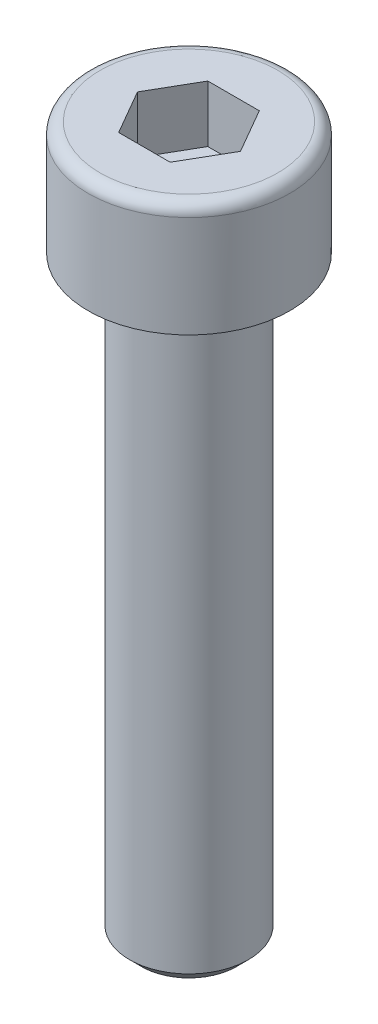
ISO-10303-21;
HEADER;
FILE_DESCRIPTION(('STEP AP214'),'2;1');
FILE_NAME('part.step','',(''),(''),'','','');
FILE_SCHEMA(('AUTOMOTIVE_DESIGN { 1 0 10303 214 1 1 1 1 }'));
ENDSEC;
DATA;
#1=APPLICATION_CONTEXT('core data for automotive mechanical design processes');
#2=APPLICATION_PROTOCOL_DEFINITION('international standard','automotive_design',2000,#1);
#3=PRODUCT_CONTEXT('',#1,'mechanical');
#4=PRODUCT('Part','Part','',(#3));
#5=PRODUCT_RELATED_PRODUCT_CATEGORY('part','',(#4));
#6=PRODUCT_DEFINITION_FORMATION('','',#4);
#7=PRODUCT_DEFINITION_CONTEXT('part definition',#1,'design');
#8=PRODUCT_DEFINITION('design','',#6,#7);
#9=PRODUCT_DEFINITION_SHAPE('','',#8);
#10=(LENGTH_UNIT() NAMED_UNIT(*) SI_UNIT(.MILLI.,.METRE.));
#11=(NAMED_UNIT(*) PLANE_ANGLE_UNIT() SI_UNIT($,.RADIAN.));
#12=(NAMED_UNIT(*) SI_UNIT($,.STERADIAN.) SOLID_ANGLE_UNIT());
#13=UNCERTAINTY_MEASURE_WITH_UNIT(LENGTH_MEASURE(1.E-05),#10,'distance_accuracy_value','');
#14=(GEOMETRIC_REPRESENTATION_CONTEXT(3) GLOBAL_UNCERTAINTY_ASSIGNED_CONTEXT((#13)) GLOBAL_UNIT_ASSIGNED_CONTEXT((#10,
#11,#12)) REPRESENTATION_CONTEXT('',''));
#15=CARTESIAN_POINT('',(0.,0.,0.));
#16=DIRECTION('',(0.,0.,1.));
#17=DIRECTION('',(1.,0.,0.));
#18=AXIS2_PLACEMENT_3D('',#15,#16,#17);
#19=CARTESIAN_POINT('',(2.,-20.,0.));
#20=DIRECTION('',(0.,-1.,0.));
#21=DIRECTION('',(0.,0.,-1.));
#22=AXIS2_PLACEMENT_3D('',#19,#20,#21);
#23=PLANE('',#22);
#24=CARTESIAN_POINT('',(0.,-20.,0.));
#25=DIRECTION('',(0.,-1.,0.));
#26=DIRECTION('',(0.,0.,-1.));
#27=AXIS2_PLACEMENT_3D('',#24,#25,#26);
#28=CIRCLE('',#27,1.6);
#29=CARTESIAN_POINT('',(0.,-20.,-1.6));
#30=VERTEX_POINT('',#29);
#31=EDGE_CURVE('E145',#30,#30,#28,.T.);
#32=ORIENTED_EDGE('',*,*,#31,.T.);
#33=EDGE_LOOP('',(#32));
#34=FACE_BOUND('',#33,.T.);
#35=ADVANCED_FACE('F32',(#34),#23,.T.);
#36=CARTESIAN_POINT('',(0.,3.82,0.));
#37=DIRECTION('',(0.,1.,0.));
#38=DIRECTION('',(0.,0.,1.));
#39=AXIS2_PLACEMENT_3D('',#36,#37,#38);
#40=PLANE('',#39);
#41=DIRECTION('',(1.,0.,0.));
#42=VECTOR('',#41,1.);
#43=CARTESIAN_POINT('',(-0.866025403784438,3.82,1.5));
#44=LINE('',#43,#42);
#45=CARTESIAN_POINT('',(-0.866025403784438,3.82,1.5));
#46=VERTEX_POINT('',#45);
#47=CARTESIAN_POINT('',(0.866025403784439,3.82,1.5));
#48=VERTEX_POINT('',#47);
#49=EDGE_CURVE('E47',#46,#48,#44,.T.);
#50=ORIENTED_EDGE('',*,*,#49,.F.);
#51=DIRECTION('',(0.5,0.,0.866025403784438));
#52=VECTOR('',#51,1.);
#53=CARTESIAN_POINT('',(-1.73205080756888,3.82,0.));
#54=LINE('',#53,#52);
#55=CARTESIAN_POINT('',(-1.73205080756888,3.82,0.));
#56=VERTEX_POINT('',#55);
#57=EDGE_CURVE('E130',#56,#46,#54,.T.);
#58=ORIENTED_EDGE('',*,*,#57,.F.);
#59=DIRECTION('',(-0.5,0.,0.866025403784439));
#60=VECTOR('',#59,1.);
#61=CARTESIAN_POINT('',(-0.866025403784439,3.82,-1.5));
#62=LINE('',#61,#60);
#63=CARTESIAN_POINT('',(-0.866025403784439,3.82,-1.5));
#64=VERTEX_POINT('',#63);
#65=EDGE_CURVE('E128',#64,#56,#62,.T.);
#66=ORIENTED_EDGE('',*,*,#65,.F.);
#67=DIRECTION('',(-1.,0.,0.));
#68=VECTOR('',#67,1.);
#69=CARTESIAN_POINT('',(0.866025403784438,3.82,-1.5));
#70=LINE('',#69,#68);
#71=CARTESIAN_POINT('',(0.866025403784438,3.82,-1.5));
#72=VERTEX_POINT('',#71);
#73=EDGE_CURVE('E95',#72,#64,#70,.T.);
#74=ORIENTED_EDGE('',*,*,#73,.F.);
#75=DIRECTION('',(-0.5,0.,-0.866025403784438));
#76=VECTOR('',#75,1.);
#77=CARTESIAN_POINT('',(1.73205080756888,3.82,0.));
#78=LINE('',#77,#76);
#79=CARTESIAN_POINT('',(1.73205080756888,3.82,0.));
#80=VERTEX_POINT('',#79);
#81=EDGE_CURVE('E124',#80,#72,#78,.T.);
#82=ORIENTED_EDGE('',*,*,#81,.F.);
#83=DIRECTION('',(0.5,0.,-0.866025403784438));
#84=VECTOR('',#83,1.);
#85=CARTESIAN_POINT('',(0.866025403784438,3.82,1.5));
#86=LINE('',#85,#84);
#87=EDGE_CURVE('E121',#48,#80,#86,.T.);
#88=ORIENTED_EDGE('',*,*,#87,.F.);
#89=EDGE_LOOP('',(#50,#58,#66,#74,#82,#88));
#90=FACE_BOUND('',#89,.T.);
#91=CARTESIAN_POINT('',(0.,3.82,0.));
#92=DIRECTION('',(0.,1.,0.));
#93=DIRECTION('',(0.,0.,1.));
#94=AXIS2_PLACEMENT_3D('',#91,#92,#93);
#95=CIRCLE('',#94,2.99);
#96=CARTESIAN_POINT('',(0.,3.82,2.99));
#97=VERTEX_POINT('',#96);
#98=EDGE_CURVE('E11',#97,#97,#95,.T.);
#99=ORIENTED_EDGE('',*,*,#98,.T.);
#100=EDGE_LOOP('',(#99));
#101=FACE_BOUND('',#100,.T.);
#102=ADVANCED_FACE('F170',(#90,#101),#40,.T.);
#103=CARTESIAN_POINT('',(0.,3.82,0.));
#104=DIRECTION('',(0.,-1.,0.));
#105=DIRECTION('',(0.,0.,-1.));
#106=AXIS2_PLACEMENT_3D('',#103,#104,#105);
#107=CYLINDRICAL_SURFACE('',#106,3.39);
#108=CARTESIAN_POINT('',(0.,3.42,0.));
#109=DIRECTION('',(0.,1.,0.));
#110=DIRECTION('',(0.,0.,1.));
#111=AXIS2_PLACEMENT_3D('',#108,#109,#110);
#112=CIRCLE('',#111,3.39);
#113=CARTESIAN_POINT('',(0.,3.42,3.39));
#114=VERTEX_POINT('',#113);
#115=EDGE_CURVE('E40',#114,#114,#112,.F.);
#116=ORIENTED_EDGE('',*,*,#115,.T.);
#117=EDGE_LOOP('',(#116));
#118=FACE_BOUND('',#117,.T.);
#119=CARTESIAN_POINT('',(0.,0.,0.));
#120=DIRECTION('',(0.,-1.,0.));
#121=DIRECTION('',(0.,0.,-1.));
#122=AXIS2_PLACEMENT_3D('',#119,#120,#121);
#123=CIRCLE('',#122,3.39);
#124=CARTESIAN_POINT('',(0.,0.,-3.39));
#125=VERTEX_POINT('',#124);
#126=EDGE_CURVE('E142',#125,#125,#123,.T.);
#127=ORIENTED_EDGE('',*,*,#126,.F.);
#128=EDGE_LOOP('',(#127));
#129=FACE_BOUND('',#128,.T.);
#130=ADVANCED_FACE('F153',(#118,#129),#107,.T.);
#131=CARTESIAN_POINT('',(3.39,0.,0.));
#132=DIRECTION('',(0.,-1.,0.));
#133=DIRECTION('',(0.,0.,-1.));
#134=AXIS2_PLACEMENT_3D('',#131,#132,#133);
#135=PLANE('',#134);
#136=ORIENTED_EDGE('',*,*,#126,.T.);
#137=EDGE_LOOP('',(#136));
#138=FACE_BOUND('',#137,.T.);
#139=CARTESIAN_POINT('',(0.,0.,0.));
#140=DIRECTION('',(0.,-1.,0.));
#141=DIRECTION('',(0.,0.,-1.));
#142=AXIS2_PLACEMENT_3D('',#139,#140,#141);
#143=CIRCLE('',#142,2.);
#144=CARTESIAN_POINT('',(0.,0.,-2.));
#145=VERTEX_POINT('',#144);
#146=EDGE_CURVE('E134',#145,#145,#143,.T.);
#147=ORIENTED_EDGE('',*,*,#146,.F.);
#148=EDGE_LOOP('',(#147));
#149=FACE_BOUND('',#148,.T.);
#150=ADVANCED_FACE('F181',(#138,#149),#135,.T.);
#151=CARTESIAN_POINT('',(0.,3.82,0.));
#152=DIRECTION('',(0.,-1.,0.));
#153=DIRECTION('',(0.,0.,-1.));
#154=AXIS2_PLACEMENT_3D('',#151,#152,#153);
#155=CYLINDRICAL_SURFACE('',#154,2.);
#156=CARTESIAN_POINT('',(0.,-19.6,0.));
#157=DIRECTION('',(0.,-1.,0.));
#158=DIRECTION('',(0.,0.,-1.));
#159=AXIS2_PLACEMENT_3D('',#156,#157,#158);
#160=CIRCLE('',#159,2.);
#161=CARTESIAN_POINT('',(0.,-19.6,-2.));
#162=VERTEX_POINT('',#161);
#163=EDGE_CURVE('E148',#162,#162,#160,.F.);
#164=ORIENTED_EDGE('',*,*,#163,.T.);
#165=EDGE_LOOP('',(#164));
#166=FACE_BOUND('',#165,.T.);
#167=ORIENTED_EDGE('',*,*,#146,.T.);
#168=EDGE_LOOP('',(#167));
#169=FACE_BOUND('',#168,.T.);
#170=ADVANCED_FACE('F166',(#166,#169),#155,.T.);
#171=CARTESIAN_POINT('',(0.,-20.,0.));
#172=DIRECTION('',(0.,1.,0.));
#173=DIRECTION('',(0.,0.,1.));
#174=AXIS2_PLACEMENT_3D('',#171,#172,#173);
#175=CONICAL_SURFACE('',#174,1.6,0.785398163397444);
#176=ORIENTED_EDGE('',*,*,#163,.F.);
#177=EDGE_LOOP('',(#176));
#178=FACE_BOUND('',#177,.T.);
#179=ORIENTED_EDGE('',*,*,#31,.F.);
#180=EDGE_LOOP('',(#179));
#181=FACE_BOUND('',#180,.T.);
#182=ADVANCED_FACE('F158',(#178,#181),#175,.T.);
#183=CARTESIAN_POINT('',(0.,3.42,0.));
#184=DIRECTION('',(0.,1.,0.));
#185=DIRECTION('',(0.,0.,1.));
#186=AXIS2_PLACEMENT_3D('',#183,#184,#185);
#187=TOROIDAL_SURFACE('',#186,2.99,0.4);
#188=ORIENTED_EDGE('',*,*,#98,.F.);
#189=EDGE_LOOP('',(#188));
#190=FACE_BOUND('',#189,.T.);
#191=ORIENTED_EDGE('',*,*,#115,.F.);
#192=EDGE_LOOP('',(#191));
#193=FACE_BOUND('',#192,.T.);
#194=ADVANCED_FACE('F34',(#190,#193),#187,.T.);
#195=CARTESIAN_POINT('',(-0.866025403784438,1.91,1.5));
#196=DIRECTION('',(0.,0.,1.));
#197=DIRECTION('',(1.,0.,0.));
#198=AXIS2_PLACEMENT_3D('',#195,#196,#197);
#199=PLANE('',#198);
#200=ORIENTED_EDGE('',*,*,#49,.T.);
#201=DIRECTION('',(0.,1.,0.));
#202=VECTOR('',#201,1.);
#203=CARTESIAN_POINT('',(0.866025403784438,1.91,1.5));
#204=LINE('',#203,#202);
#205=CARTESIAN_POINT('',(0.866025403784438,1.91,1.5));
#206=VERTEX_POINT('',#205);
#207=EDGE_CURVE('E77',#206,#48,#204,.T.);
#208=ORIENTED_EDGE('',*,*,#207,.F.);
#209=DIRECTION('',(1.,0.,0.));
#210=VECTOR('',#209,1.);
#211=CARTESIAN_POINT('',(-0.866025403784438,1.91,1.5));
#212=LINE('',#211,#210);
#213=CARTESIAN_POINT('',(-0.866025403784438,1.91,1.5));
#214=VERTEX_POINT('',#213);
#215=EDGE_CURVE('E132',#214,#206,#212,.T.);
#216=ORIENTED_EDGE('',*,*,#215,.F.);
#217=DIRECTION('',(0.,1.,0.));
#218=VECTOR('',#217,1.);
#219=CARTESIAN_POINT('',(-0.866025403784438,1.91,1.5));
#220=LINE('',#219,#218);
#221=EDGE_CURVE('E55',#214,#46,#220,.T.);
#222=ORIENTED_EDGE('',*,*,#221,.T.);
#223=EDGE_LOOP('',(#200,#208,#216,#222));
#224=FACE_BOUND('',#223,.T.);
#225=ADVANCED_FACE('F157',(#224),#199,.F.);
#226=CARTESIAN_POINT('',(-1.73205080756888,1.91,0.));
#227=DIRECTION('',(-0.866025403784438,0.,0.5));
#228=DIRECTION('',(0.5,0.,0.866025403784439));
#229=AXIS2_PLACEMENT_3D('',#226,#227,#228);
#230=PLANE('',#229);
#231=ORIENTED_EDGE('',*,*,#57,.T.);
#232=ORIENTED_EDGE('',*,*,#221,.F.);
#233=DIRECTION('',(0.5,0.,0.866025403784438));
#234=VECTOR('',#233,1.);
#235=CARTESIAN_POINT('',(-1.73205080756888,1.91,0.));
#236=LINE('',#235,#234);
#237=CARTESIAN_POINT('',(-1.73205080756888,1.91,0.));
#238=VERTEX_POINT('',#237);
#239=EDGE_CURVE('E107',#238,#214,#236,.T.);
#240=ORIENTED_EDGE('',*,*,#239,.F.);
#241=DIRECTION('',(0.,1.,0.));
#242=VECTOR('',#241,1.);
#243=CARTESIAN_POINT('',(-1.73205080756888,1.91,0.));
#244=LINE('',#243,#242);
#245=EDGE_CURVE('E99',#238,#56,#244,.T.);
#246=ORIENTED_EDGE('',*,*,#245,.T.);
#247=EDGE_LOOP('',(#231,#232,#240,#246));
#248=FACE_BOUND('',#247,.T.);
#249=ADVANCED_FACE('F164',(#248),#230,.F.);
#250=CARTESIAN_POINT('',(-0.866025403784439,1.91,-1.5));
#251=DIRECTION('',(-0.866025403784439,0.,-0.5));
#252=DIRECTION('',(-0.5,0.,0.866025403784439));
#253=AXIS2_PLACEMENT_3D('',#250,#251,#252);
#254=PLANE('',#253);
#255=ORIENTED_EDGE('',*,*,#65,.T.);
#256=ORIENTED_EDGE('',*,*,#245,.F.);
#257=DIRECTION('',(-0.5,0.,0.866025403784439));
#258=VECTOR('',#257,1.);
#259=CARTESIAN_POINT('',(-0.866025403784439,1.91,-1.5));
#260=LINE('',#259,#258);
#261=CARTESIAN_POINT('',(-0.866025403784439,1.91,-1.5));
#262=VERTEX_POINT('',#261);
#263=EDGE_CURVE('E103',#262,#238,#260,.T.);
#264=ORIENTED_EDGE('',*,*,#263,.F.);
#265=DIRECTION('',(0.,1.,0.));
#266=VECTOR('',#265,1.);
#267=CARTESIAN_POINT('',(-0.866025403784439,1.91,-1.5));
#268=LINE('',#267,#266);
#269=EDGE_CURVE('E88',#262,#64,#268,.T.);
#270=ORIENTED_EDGE('',*,*,#269,.T.);
#271=EDGE_LOOP('',(#255,#256,#264,#270));
#272=FACE_BOUND('',#271,.T.);
#273=ADVANCED_FACE('F104',(#272),#254,.F.);
#274=CARTESIAN_POINT('',(0.866025403784438,1.91,-1.5));
#275=DIRECTION('',(0.,0.,-1.));
#276=DIRECTION('',(-1.,0.,0.));
#277=AXIS2_PLACEMENT_3D('',#274,#275,#276);
#278=PLANE('',#277);
#279=ORIENTED_EDGE('',*,*,#73,.T.);
#280=ORIENTED_EDGE('',*,*,#269,.F.);
#281=DIRECTION('',(-1.,0.,0.));
#282=VECTOR('',#281,1.);
#283=CARTESIAN_POINT('',(0.866025403784438,1.91,-1.5));
#284=LINE('',#283,#282);
#285=CARTESIAN_POINT('',(0.866025403784438,1.91,-1.5));
#286=VERTEX_POINT('',#285);
#287=EDGE_CURVE('E92',#286,#262,#284,.T.);
#288=ORIENTED_EDGE('',*,*,#287,.F.);
#289=DIRECTION('',(0.,1.,0.));
#290=VECTOR('',#289,1.);
#291=CARTESIAN_POINT('',(0.866025403784438,1.91,-1.5));
#292=LINE('',#291,#290);
#293=EDGE_CURVE('E100',#286,#72,#292,.T.);
#294=ORIENTED_EDGE('',*,*,#293,.T.);
#295=EDGE_LOOP('',(#279,#280,#288,#294));
#296=FACE_BOUND('',#295,.T.);
#297=ADVANCED_FACE('F90',(#296),#278,.F.);
#298=CARTESIAN_POINT('',(1.73205080756888,1.91,0.));
#299=DIRECTION('',(0.866025403784438,0.,-0.5));
#300=DIRECTION('',(-0.5,0.,-0.866025403784438));
#301=AXIS2_PLACEMENT_3D('',#298,#299,#300);
#302=PLANE('',#301);
#303=ORIENTED_EDGE('',*,*,#81,.T.);
#304=ORIENTED_EDGE('',*,*,#293,.F.);
#305=DIRECTION('',(-0.5,0.,-0.866025403784438));
#306=VECTOR('',#305,1.);
#307=CARTESIAN_POINT('',(1.73205080756888,1.91,0.));
#308=LINE('',#307,#306);
#309=CARTESIAN_POINT('',(1.73205080756888,1.91,0.));
#310=VERTEX_POINT('',#309);
#311=EDGE_CURVE('E113',#310,#286,#308,.T.);
#312=ORIENTED_EDGE('',*,*,#311,.F.);
#313=DIRECTION('',(0.,1.,0.));
#314=VECTOR('',#313,1.);
#315=CARTESIAN_POINT('',(1.73205080756888,1.91,0.));
#316=LINE('',#315,#314);
#317=EDGE_CURVE('E137',#310,#80,#316,.T.);
#318=ORIENTED_EDGE('',*,*,#317,.T.);
#319=EDGE_LOOP('',(#303,#304,#312,#318));
#320=FACE_BOUND('',#319,.T.);
#321=ADVANCED_FACE('F191',(#320),#302,.F.);
#322=CARTESIAN_POINT('',(0.866025403784438,1.91,1.5));
#323=DIRECTION('',(0.866025403784439,0.,0.5));
#324=DIRECTION('',(0.5,0.,-0.866025403784439));
#325=AXIS2_PLACEMENT_3D('',#322,#323,#324);
#326=PLANE('',#325);
#327=ORIENTED_EDGE('',*,*,#87,.T.);
#328=ORIENTED_EDGE('',*,*,#317,.F.);
#329=DIRECTION('',(0.5,0.,-0.866025403784438));
#330=VECTOR('',#329,1.);
#331=CARTESIAN_POINT('',(0.866025403784438,1.91,1.5));
#332=LINE('',#331,#330);
#333=EDGE_CURVE('E115',#206,#310,#332,.T.);
#334=ORIENTED_EDGE('',*,*,#333,.F.);
#335=ORIENTED_EDGE('',*,*,#207,.T.);
#336=EDGE_LOOP('',(#327,#328,#334,#335));
#337=FACE_BOUND('',#336,.T.);
#338=ADVANCED_FACE('F188',(#337),#326,.F.);
#339=CARTESIAN_POINT('',(0.,1.91,0.));
#340=DIRECTION('',(0.,1.,0.));
#341=DIRECTION('',(0.,0.,1.));
#342=AXIS2_PLACEMENT_3D('',#339,#340,#341);
#343=PLANE('',#342);
#344=ORIENTED_EDGE('',*,*,#215,.T.);
#345=ORIENTED_EDGE('',*,*,#333,.T.);
#346=ORIENTED_EDGE('',*,*,#311,.T.);
#347=ORIENTED_EDGE('',*,*,#287,.T.);
#348=ORIENTED_EDGE('',*,*,#263,.T.);
#349=ORIENTED_EDGE('',*,*,#239,.T.);
#350=EDGE_LOOP('',(#344,#345,#346,#347,#348,#349));
#351=FACE_BOUND('',#350,.T.);
#352=ADVANCED_FACE('F110',(#351),#343,.T.);
#353=CLOSED_SHELL('',(#35,#102,#130,#150,#170,#182,#194,#225,#249,#273,#297,#321,#338,#352));
#354=MANIFOLD_SOLID_BREP('B2',#353);
#355=ADVANCED_BREP_SHAPE_REPRESENTATION('',(#18,#354),#14);
#356=SHAPE_DEFINITION_REPRESENTATION(#9,#355);
ENDSEC;
END-ISO-10303-21;
